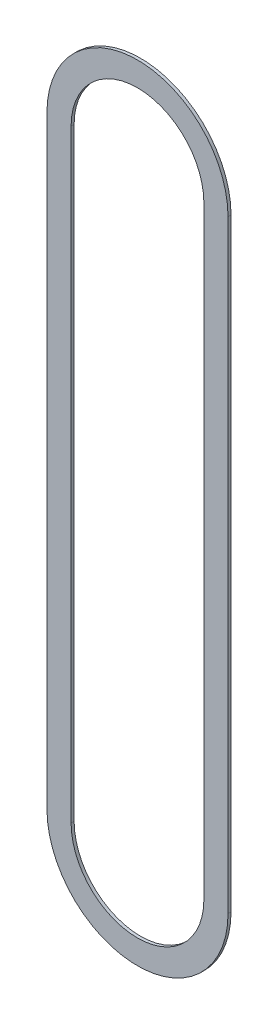
ISO-10303-21;
HEADER;
FILE_DESCRIPTION(('STEP AP214'),'2;1');
FILE_NAME('part.step','',(''),(''),'','','');
FILE_SCHEMA(('AUTOMOTIVE_DESIGN { 1 0 10303 214 1 1 1 1 }'));
ENDSEC;
DATA;
#1=APPLICATION_CONTEXT('core data for automotive mechanical design processes');
#2=APPLICATION_PROTOCOL_DEFINITION('international standard','automotive_design',2000,#1);
#3=PRODUCT_CONTEXT('',#1,'mechanical');
#4=PRODUCT('Part','Part','',(#3));
#5=PRODUCT_RELATED_PRODUCT_CATEGORY('part','',(#4));
#6=PRODUCT_DEFINITION_FORMATION('','',#4);
#7=PRODUCT_DEFINITION_CONTEXT('part definition',#1,'design');
#8=PRODUCT_DEFINITION('design','',#6,#7);
#9=PRODUCT_DEFINITION_SHAPE('','',#8);
#10=(LENGTH_UNIT() NAMED_UNIT(*) SI_UNIT(.MILLI.,.METRE.));
#11=(NAMED_UNIT(*) PLANE_ANGLE_UNIT() SI_UNIT($,.RADIAN.));
#12=(NAMED_UNIT(*) SI_UNIT($,.STERADIAN.) SOLID_ANGLE_UNIT());
#13=UNCERTAINTY_MEASURE_WITH_UNIT(LENGTH_MEASURE(1.E-05),#10,'distance_accuracy_value','');
#14=(GEOMETRIC_REPRESENTATION_CONTEXT(3) GLOBAL_UNCERTAINTY_ASSIGNED_CONTEXT((#13)) GLOBAL_UNIT_ASSIGNED_CONTEXT((#10,
#11,#12)) REPRESENTATION_CONTEXT('',''));
#15=CARTESIAN_POINT('',(0.,0.,0.));
#16=DIRECTION('',(0.,0.,1.));
#17=DIRECTION('',(1.,0.,0.));
#18=AXIS2_PLACEMENT_3D('',#15,#16,#17);
#19=CARTESIAN_POINT('',(0.,50.,0.5));
#20=DIRECTION('',(0.,0.,1.));
#21=DIRECTION('',(1.,0.,0.));
#22=AXIS2_PLACEMENT_3D('',#19,#20,#21);
#23=PLANE('',#22);
#24=CARTESIAN_POINT('',(0.,50.,0.5));
#25=DIRECTION('',(0.,0.,1.));
#26=DIRECTION('',(1.,0.,0.));
#27=AXIS2_PLACEMENT_3D('',#24,#25,#26);
#28=CIRCLE('',#27,15.);
#29=CARTESIAN_POINT('',(15.,50.,0.5));
#30=VERTEX_POINT('',#29);
#31=CARTESIAN_POINT('',(-15.,50.,0.5));
#32=VERTEX_POINT('',#31);
#33=EDGE_CURVE('E134',#30,#32,#28,.T.);
#34=ORIENTED_EDGE('',*,*,#33,.T.);
#35=DIRECTION('',(0.,-1.,0.));
#36=VECTOR('',#35,1.);
#37=CARTESIAN_POINT('',(-15.,50.,0.5));
#38=LINE('',#37,#36);
#39=CARTESIAN_POINT('',(-15.,-50.,0.5));
#40=VERTEX_POINT('',#39);
#41=EDGE_CURVE('E137',#32,#40,#38,.T.);
#42=ORIENTED_EDGE('',*,*,#41,.T.);
#43=CARTESIAN_POINT('',(0.,-50.,0.5));
#44=DIRECTION('',(0.,0.,1.));
#45=DIRECTION('',(1.,0.,0.));
#46=AXIS2_PLACEMENT_3D('',#43,#44,#45);
#47=CIRCLE('',#46,15.);
#48=CARTESIAN_POINT('',(15.,-50.,0.5));
#49=VERTEX_POINT('',#48);
#50=EDGE_CURVE('E140',#40,#49,#47,.T.);
#51=ORIENTED_EDGE('',*,*,#50,.T.);
#52=DIRECTION('',(0.,1.,0.));
#53=VECTOR('',#52,1.);
#54=CARTESIAN_POINT('',(15.,50.,0.5));
#55=LINE('',#54,#53);
#56=EDGE_CURVE('E142',#49,#30,#55,.T.);
#57=ORIENTED_EDGE('',*,*,#56,.T.);
#58=EDGE_LOOP('',(#34,#42,#51,#57));
#59=FACE_BOUND('',#58,.T.);
#60=DIRECTION('',(0.,-1.,0.));
#61=VECTOR('',#60,1.);
#62=CARTESIAN_POINT('',(-11.,50.,0.5));
#63=LINE('',#62,#61);
#64=CARTESIAN_POINT('',(-11.,50.,0.5));
#65=VERTEX_POINT('',#64);
#66=CARTESIAN_POINT('',(-11.,-50.,0.5));
#67=VERTEX_POINT('',#66);
#68=EDGE_CURVE('E106',#65,#67,#63,.T.);
#69=ORIENTED_EDGE('',*,*,#68,.F.);
#70=CARTESIAN_POINT('',(0.,50.,0.5));
#71=DIRECTION('',(0.,0.,1.));
#72=DIRECTION('',(1.,0.,0.));
#73=AXIS2_PLACEMENT_3D('',#70,#71,#72);
#74=CIRCLE('',#73,11.);
#75=CARTESIAN_POINT('',(11.,50.,0.5));
#76=VERTEX_POINT('',#75);
#77=EDGE_CURVE('E98',#76,#65,#74,.T.);
#78=ORIENTED_EDGE('',*,*,#77,.F.);
#79=DIRECTION('',(0.,1.,0.));
#80=VECTOR('',#79,1.);
#81=CARTESIAN_POINT('',(11.,50.,0.5));
#82=LINE('',#81,#80);
#83=CARTESIAN_POINT('',(11.,-50.,0.5));
#84=VERTEX_POINT('',#83);
#85=EDGE_CURVE('E120',#84,#76,#82,.T.);
#86=ORIENTED_EDGE('',*,*,#85,.F.);
#87=CARTESIAN_POINT('',(0.,-50.,0.5));
#88=DIRECTION('',(0.,0.,1.));
#89=DIRECTION('',(1.,0.,0.));
#90=AXIS2_PLACEMENT_3D('',#87,#88,#89);
#91=CIRCLE('',#90,11.);
#92=EDGE_CURVE('E118',#67,#84,#91,.T.);
#93=ORIENTED_EDGE('',*,*,#92,.F.);
#94=EDGE_LOOP('',(#69,#78,#86,#93));
#95=FACE_BOUND('',#94,.T.);
#96=ADVANCED_FACE('F33',(#59,#95),#23,.T.);
#97=CARTESIAN_POINT('',(0.,50.,0.));
#98=DIRECTION('',(0.,0.,1.));
#99=DIRECTION('',(1.,0.,0.));
#100=AXIS2_PLACEMENT_3D('',#97,#98,#99);
#101=PLANE('',#100);
#102=CARTESIAN_POINT('',(0.,50.,0.));
#103=DIRECTION('',(0.,0.,1.));
#104=DIRECTION('',(1.,0.,0.));
#105=AXIS2_PLACEMENT_3D('',#102,#103,#104);
#106=CIRCLE('',#105,15.);
#107=CARTESIAN_POINT('',(15.,50.,0.));
#108=VERTEX_POINT('',#107);
#109=CARTESIAN_POINT('',(-15.,50.,0.));
#110=VERTEX_POINT('',#109);
#111=EDGE_CURVE('E114',#108,#110,#106,.T.);
#112=ORIENTED_EDGE('',*,*,#111,.F.);
#113=DIRECTION('',(0.,1.,0.));
#114=VECTOR('',#113,1.);
#115=CARTESIAN_POINT('',(15.,50.,0.));
#116=LINE('',#115,#114);
#117=CARTESIAN_POINT('',(15.,-50.,0.));
#118=VERTEX_POINT('',#117);
#119=EDGE_CURVE('E138',#118,#108,#116,.T.);
#120=ORIENTED_EDGE('',*,*,#119,.F.);
#121=CARTESIAN_POINT('',(0.,-50.,0.));
#122=DIRECTION('',(0.,0.,1.));
#123=DIRECTION('',(1.,0.,0.));
#124=AXIS2_PLACEMENT_3D('',#121,#122,#123);
#125=CIRCLE('',#124,15.);
#126=CARTESIAN_POINT('',(-15.,-50.,0.));
#127=VERTEX_POINT('',#126);
#128=EDGE_CURVE('E149',#127,#118,#125,.T.);
#129=ORIENTED_EDGE('',*,*,#128,.F.);
#130=DIRECTION('',(0.,-1.,0.));
#131=VECTOR('',#130,1.);
#132=CARTESIAN_POINT('',(-15.,50.,0.));
#133=LINE('',#132,#131);
#134=EDGE_CURVE('E147',#110,#127,#133,.T.);
#135=ORIENTED_EDGE('',*,*,#134,.F.);
#136=EDGE_LOOP('',(#112,#120,#129,#135));
#137=FACE_BOUND('',#136,.T.);
#138=CARTESIAN_POINT('',(0.,50.,0.));
#139=DIRECTION('',(0.,0.,1.));
#140=DIRECTION('',(1.,0.,0.));
#141=AXIS2_PLACEMENT_3D('',#138,#139,#140);
#142=CIRCLE('',#141,11.);
#143=CARTESIAN_POINT('',(11.,50.,0.));
#144=VERTEX_POINT('',#143);
#145=CARTESIAN_POINT('',(-11.,50.,0.));
#146=VERTEX_POINT('',#145);
#147=EDGE_CURVE('E56',#144,#146,#142,.T.);
#148=ORIENTED_EDGE('',*,*,#147,.T.);
#149=DIRECTION('',(0.,-1.,0.));
#150=VECTOR('',#149,1.);
#151=CARTESIAN_POINT('',(-11.,50.,0.));
#152=LINE('',#151,#150);
#153=CARTESIAN_POINT('',(-11.,-50.,0.));
#154=VERTEX_POINT('',#153);
#155=EDGE_CURVE('E113',#146,#154,#152,.T.);
#156=ORIENTED_EDGE('',*,*,#155,.T.);
#157=CARTESIAN_POINT('',(0.,-50.,0.));
#158=DIRECTION('',(0.,0.,1.));
#159=DIRECTION('',(1.,0.,0.));
#160=AXIS2_PLACEMENT_3D('',#157,#158,#159);
#161=CIRCLE('',#160,11.);
#162=CARTESIAN_POINT('',(11.,-50.,0.));
#163=VERTEX_POINT('',#162);
#164=EDGE_CURVE('E126',#154,#163,#161,.T.);
#165=ORIENTED_EDGE('',*,*,#164,.T.);
#166=DIRECTION('',(0.,1.,0.));
#167=VECTOR('',#166,1.);
#168=CARTESIAN_POINT('',(11.,50.,0.));
#169=LINE('',#168,#167);
#170=EDGE_CURVE('E107',#163,#144,#169,.T.);
#171=ORIENTED_EDGE('',*,*,#170,.T.);
#172=EDGE_LOOP('',(#148,#156,#165,#171));
#173=FACE_BOUND('',#172,.T.);
#174=ADVANCED_FACE('F167',(#137,#173),#101,.F.);
#175=CARTESIAN_POINT('',(0.,50.,0.5));
#176=DIRECTION('',(0.,0.,-1.));
#177=DIRECTION('',(-1.,0.,0.));
#178=AXIS2_PLACEMENT_3D('',#175,#176,#177);
#179=CYLINDRICAL_SURFACE('',#178,15.);
#180=ORIENTED_EDGE('',*,*,#111,.T.);
#181=DIRECTION('',(0.,0.,-1.));
#182=VECTOR('',#181,1.);
#183=CARTESIAN_POINT('',(-15.,50.,0.5));
#184=LINE('',#183,#182);
#185=EDGE_CURVE('E11',#32,#110,#184,.T.);
#186=ORIENTED_EDGE('',*,*,#185,.F.);
#187=ORIENTED_EDGE('',*,*,#33,.F.);
#188=DIRECTION('',(0.,0.,-1.));
#189=VECTOR('',#188,1.);
#190=CARTESIAN_POINT('',(15.,50.,0.5));
#191=LINE('',#190,#189);
#192=EDGE_CURVE('E144',#30,#108,#191,.T.);
#193=ORIENTED_EDGE('',*,*,#192,.T.);
#194=EDGE_LOOP('',(#180,#186,#187,#193));
#195=FACE_BOUND('',#194,.T.);
#196=ADVANCED_FACE('F35',(#195),#179,.T.);
#197=CARTESIAN_POINT('',(-15.,50.,0.5));
#198=DIRECTION('',(1.,0.,0.));
#199=DIRECTION('',(0.,1.,0.));
#200=AXIS2_PLACEMENT_3D('',#197,#198,#199);
#201=PLANE('',#200);
#202=ORIENTED_EDGE('',*,*,#134,.T.);
#203=DIRECTION('',(0.,0.,-1.));
#204=VECTOR('',#203,1.);
#205=CARTESIAN_POINT('',(-15.,-50.,0.5));
#206=LINE('',#205,#204);
#207=EDGE_CURVE('E41',#40,#127,#206,.T.);
#208=ORIENTED_EDGE('',*,*,#207,.F.);
#209=ORIENTED_EDGE('',*,*,#41,.F.);
#210=ORIENTED_EDGE('',*,*,#185,.T.);
#211=EDGE_LOOP('',(#202,#208,#209,#210));
#212=FACE_BOUND('',#211,.T.);
#213=ADVANCED_FACE('F177',(#212),#201,.F.);
#214=CARTESIAN_POINT('',(0.,-50.,0.5));
#215=DIRECTION('',(0.,0.,-1.));
#216=DIRECTION('',(-1.,0.,0.));
#217=AXIS2_PLACEMENT_3D('',#214,#215,#216);
#218=CYLINDRICAL_SURFACE('',#217,15.);
#219=ORIENTED_EDGE('',*,*,#128,.T.);
#220=DIRECTION('',(0.,0.,-1.));
#221=VECTOR('',#220,1.);
#222=CARTESIAN_POINT('',(15.,-50.,0.5));
#223=LINE('',#222,#221);
#224=EDGE_CURVE('E154',#49,#118,#223,.T.);
#225=ORIENTED_EDGE('',*,*,#224,.F.);
#226=ORIENTED_EDGE('',*,*,#50,.F.);
#227=ORIENTED_EDGE('',*,*,#207,.T.);
#228=EDGE_LOOP('',(#219,#225,#226,#227));
#229=FACE_BOUND('',#228,.T.);
#230=ADVANCED_FACE('F161',(#229),#218,.T.);
#231=CARTESIAN_POINT('',(15.,50.,0.5));
#232=DIRECTION('',(-1.,0.,0.));
#233=DIRECTION('',(0.,-1.,0.));
#234=AXIS2_PLACEMENT_3D('',#231,#232,#233);
#235=PLANE('',#234);
#236=ORIENTED_EDGE('',*,*,#119,.T.);
#237=ORIENTED_EDGE('',*,*,#192,.F.);
#238=ORIENTED_EDGE('',*,*,#56,.F.);
#239=ORIENTED_EDGE('',*,*,#224,.T.);
#240=EDGE_LOOP('',(#236,#237,#238,#239));
#241=FACE_BOUND('',#240,.T.);
#242=ADVANCED_FACE('F171',(#241),#235,.F.);
#243=CARTESIAN_POINT('',(0.,50.,0.5));
#244=DIRECTION('',(0.,0.,-1.));
#245=DIRECTION('',(-1.,0.,0.));
#246=AXIS2_PLACEMENT_3D('',#243,#244,#245);
#247=CYLINDRICAL_SURFACE('',#246,11.);
#248=ORIENTED_EDGE('',*,*,#147,.F.);
#249=DIRECTION('',(0.,0.,-1.));
#250=VECTOR('',#249,1.);
#251=CARTESIAN_POINT('',(11.,50.,0.5));
#252=LINE('',#251,#250);
#253=EDGE_CURVE('E102',#76,#144,#252,.T.);
#254=ORIENTED_EDGE('',*,*,#253,.F.);
#255=ORIENTED_EDGE('',*,*,#77,.T.);
#256=DIRECTION('',(0.,0.,-1.));
#257=VECTOR('',#256,1.);
#258=CARTESIAN_POINT('',(-11.,50.,0.5));
#259=LINE('',#258,#257);
#260=EDGE_CURVE('E101',#65,#146,#259,.T.);
#261=ORIENTED_EDGE('',*,*,#260,.T.);
#262=EDGE_LOOP('',(#248,#254,#255,#261));
#263=FACE_BOUND('',#262,.T.);
#264=ADVANCED_FACE('F100',(#263),#247,.F.);
#265=CARTESIAN_POINT('',(-11.,50.,0.5));
#266=DIRECTION('',(1.,0.,0.));
#267=DIRECTION('',(0.,1.,0.));
#268=AXIS2_PLACEMENT_3D('',#265,#266,#267);
#269=PLANE('',#268);
#270=ORIENTED_EDGE('',*,*,#155,.F.);
#271=ORIENTED_EDGE('',*,*,#260,.F.);
#272=ORIENTED_EDGE('',*,*,#68,.T.);
#273=DIRECTION('',(0.,0.,-1.));
#274=VECTOR('',#273,1.);
#275=CARTESIAN_POINT('',(-11.,-50.,0.5));
#276=LINE('',#275,#274);
#277=EDGE_CURVE('E115',#67,#154,#276,.T.);
#278=ORIENTED_EDGE('',*,*,#277,.T.);
#279=EDGE_LOOP('',(#270,#271,#272,#278));
#280=FACE_BOUND('',#279,.T.);
#281=ADVANCED_FACE('F110',(#280),#269,.T.);
#282=CARTESIAN_POINT('',(0.,-50.,0.5));
#283=DIRECTION('',(0.,0.,-1.));
#284=DIRECTION('',(-1.,0.,0.));
#285=AXIS2_PLACEMENT_3D('',#282,#283,#284);
#286=CYLINDRICAL_SURFACE('',#285,11.);
#287=ORIENTED_EDGE('',*,*,#164,.F.);
#288=ORIENTED_EDGE('',*,*,#277,.F.);
#289=ORIENTED_EDGE('',*,*,#92,.T.);
#290=DIRECTION('',(0.,0.,-1.));
#291=VECTOR('',#290,1.);
#292=CARTESIAN_POINT('',(11.,-50.,0.5));
#293=LINE('',#292,#291);
#294=EDGE_CURVE('E48',#84,#163,#293,.T.);
#295=ORIENTED_EDGE('',*,*,#294,.T.);
#296=EDGE_LOOP('',(#287,#288,#289,#295));
#297=FACE_BOUND('',#296,.T.);
#298=ADVANCED_FACE('F200',(#297),#286,.F.);
#299=CARTESIAN_POINT('',(11.,50.,0.5));
#300=DIRECTION('',(-1.,0.,0.));
#301=DIRECTION('',(0.,-1.,0.));
#302=AXIS2_PLACEMENT_3D('',#299,#300,#301);
#303=PLANE('',#302);
#304=ORIENTED_EDGE('',*,*,#170,.F.);
#305=ORIENTED_EDGE('',*,*,#294,.F.);
#306=ORIENTED_EDGE('',*,*,#85,.T.);
#307=ORIENTED_EDGE('',*,*,#253,.T.);
#308=EDGE_LOOP('',(#304,#305,#306,#307));
#309=FACE_BOUND('',#308,.T.);
#310=ADVANCED_FACE('F204',(#309),#303,.T.);
#311=CLOSED_SHELL('',(#96,#174,#196,#213,#230,#242,#264,#281,#298,#310));
#312=MANIFOLD_SOLID_BREP('B2',#311);
#313=ADVANCED_BREP_SHAPE_REPRESENTATION('',(#18,#312),#14);
#314=SHAPE_DEFINITION_REPRESENTATION(#9,#313);
ENDSEC;
END-ISO-10303-21;
